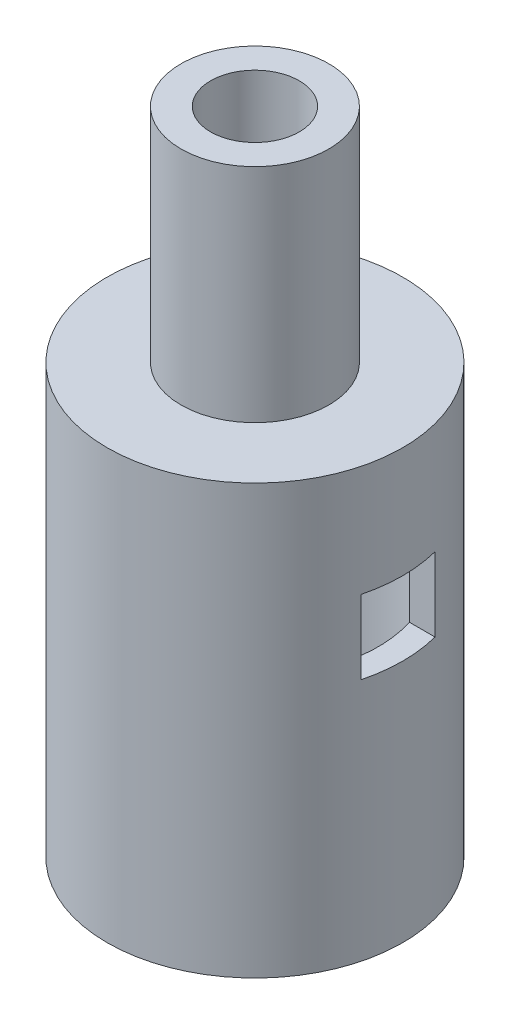
ISO-10303-21;
HEADER;
FILE_DESCRIPTION(('STEP AP214'),'2;1');
FILE_NAME('part.step','',(''),(''),'','','');
FILE_SCHEMA(('AUTOMOTIVE_DESIGN { 1 0 10303 214 1 1 1 1 }'));
ENDSEC;
DATA;
#1=APPLICATION_CONTEXT('core data for automotive mechanical design processes');
#2=APPLICATION_PROTOCOL_DEFINITION('international standard','automotive_design',2000,#1);
#3=PRODUCT_CONTEXT('',#1,'mechanical');
#4=PRODUCT('Part','Part','',(#3));
#5=PRODUCT_RELATED_PRODUCT_CATEGORY('part','',(#4));
#6=PRODUCT_DEFINITION_FORMATION('','',#4);
#7=PRODUCT_DEFINITION_CONTEXT('part definition',#1,'design');
#8=PRODUCT_DEFINITION('design','',#6,#7);
#9=PRODUCT_DEFINITION_SHAPE('','',#8);
#10=(LENGTH_UNIT() NAMED_UNIT(*) SI_UNIT(.MILLI.,.METRE.));
#11=(NAMED_UNIT(*) PLANE_ANGLE_UNIT() SI_UNIT($,.RADIAN.));
#12=(NAMED_UNIT(*) SI_UNIT($,.STERADIAN.) SOLID_ANGLE_UNIT());
#13=UNCERTAINTY_MEASURE_WITH_UNIT(LENGTH_MEASURE(1.E-05),#10,'distance_accuracy_value','');
#14=(GEOMETRIC_REPRESENTATION_CONTEXT(3) GLOBAL_UNCERTAINTY_ASSIGNED_CONTEXT((#13)) GLOBAL_UNIT_ASSIGNED_CONTEXT((#10,
#11,#12)) REPRESENTATION_CONTEXT('',''));
#15=CARTESIAN_POINT('',(0.,0.,0.));
#16=DIRECTION('',(0.,0.,1.));
#17=DIRECTION('',(1.,0.,0.));
#18=AXIS2_PLACEMENT_3D('',#15,#16,#17);
#19=CARTESIAN_POINT('',(0.,-22.098,0.));
#20=DIRECTION('',(0.,1.,0.));
#21=DIRECTION('',(0.,0.,1.));
#22=AXIS2_PLACEMENT_3D('',#19,#20,#21);
#23=CYLINDRICAL_SURFACE('',#22,7.62);
#24=CARTESIAN_POINT('',(0.,-5.715,0.));
#25=DIRECTION('',(0.,1.,0.));
#26=DIRECTION('',(0.,0.,1.));
#27=AXIS2_PLACEMENT_3D('',#24,#25,#26);
#28=CIRCLE('',#27,7.62);
#29=CARTESIAN_POINT('',(-7.37803327452513,-5.715,1.905));
#30=VERTEX_POINT('',#29);
#31=CARTESIAN_POINT('',(-7.37803327452513,-5.715,-1.905));
#32=VERTEX_POINT('',#31);
#33=EDGE_CURVE('E124',#30,#32,#28,.F.);
#34=ORIENTED_EDGE('',*,*,#33,.F.);
#35=DIRECTION('',(0.,1.,0.));
#36=VECTOR('',#35,1.);
#37=CARTESIAN_POINT('',(-7.37803327452513,-22.098,1.90499999999999));
#38=LINE('',#37,#36);
#39=CARTESIAN_POINT('',(-7.37803327452513,-9.525,1.905));
#40=VERTEX_POINT('',#39);
#41=EDGE_CURVE('E111',#40,#30,#38,.T.);
#42=ORIENTED_EDGE('',*,*,#41,.F.);
#43=CARTESIAN_POINT('',(0.,-9.525,0.));
#44=DIRECTION('',(0.,-1.,0.));
#45=DIRECTION('',(0.,0.,-1.));
#46=AXIS2_PLACEMENT_3D('',#43,#44,#45);
#47=CIRCLE('',#46,7.62);
#48=CARTESIAN_POINT('',(-7.37803327452513,-9.525,-1.905));
#49=VERTEX_POINT('',#48);
#50=EDGE_CURVE('E143',#49,#40,#47,.F.);
#51=ORIENTED_EDGE('',*,*,#50,.F.);
#52=DIRECTION('',(0.,1.,0.));
#53=VECTOR('',#52,1.);
#54=CARTESIAN_POINT('',(-7.37803327452513,-22.098,-1.905));
#55=LINE('',#54,#53);
#56=EDGE_CURVE('E132',#32,#49,#55,.F.);
#57=ORIENTED_EDGE('',*,*,#56,.F.);
#58=EDGE_LOOP('',(#34,#42,#51,#57));
#59=FACE_BOUND('',#58,.T.);
#60=CARTESIAN_POINT('',(7.37803327452513,-5.715,-1.905));
#61=VERTEX_POINT('',#60);
#62=CARTESIAN_POINT('',(7.37803327452513,-5.715,1.905));
#63=VERTEX_POINT('',#62);
#64=EDGE_CURVE('E131',#61,#63,#28,.F.);
#65=ORIENTED_EDGE('',*,*,#64,.F.);
#66=DIRECTION('',(0.,1.,0.));
#67=VECTOR('',#66,1.);
#68=CARTESIAN_POINT('',(7.37803327452513,-22.098,-1.905));
#69=LINE('',#68,#67);
#70=CARTESIAN_POINT('',(7.37803327452513,-9.525,-1.905));
#71=VERTEX_POINT('',#70);
#72=EDGE_CURVE('E149',#71,#61,#69,.T.);
#73=ORIENTED_EDGE('',*,*,#72,.F.);
#74=CARTESIAN_POINT('',(7.37803327452513,-9.525,1.905));
#75=VERTEX_POINT('',#74);
#76=EDGE_CURVE('E144',#75,#71,#47,.F.);
#77=ORIENTED_EDGE('',*,*,#76,.F.);
#78=DIRECTION('',(0.,1.,0.));
#79=VECTOR('',#78,1.);
#80=CARTESIAN_POINT('',(7.37803327452513,-22.098,1.90499999999999));
#81=LINE('',#80,#79);
#82=EDGE_CURVE('E125',#63,#75,#81,.F.);
#83=ORIENTED_EDGE('',*,*,#82,.F.);
#84=EDGE_LOOP('',(#65,#73,#77,#83));
#85=FACE_BOUND('',#84,.T.);
#86=CARTESIAN_POINT('',(0.,-22.098,0.));
#87=DIRECTION('',(0.,1.,0.));
#88=DIRECTION('',(0.,0.,1.));
#89=AXIS2_PLACEMENT_3D('',#86,#87,#88);
#90=CIRCLE('',#89,7.62);
#91=CARTESIAN_POINT('',(0.,-22.098,7.62));
#92=VERTEX_POINT('',#91);
#93=EDGE_CURVE('E177',#92,#92,#90,.T.);
#94=ORIENTED_EDGE('',*,*,#93,.T.);
#95=EDGE_LOOP('',(#94));
#96=FACE_BOUND('',#95,.T.);
#97=CARTESIAN_POINT('',(0.,0.,0.));
#98=DIRECTION('',(0.,1.,0.));
#99=DIRECTION('',(0.,0.,1.));
#100=AXIS2_PLACEMENT_3D('',#97,#98,#99);
#101=CIRCLE('',#100,7.62);
#102=CARTESIAN_POINT('',(0.,0.,7.62));
#103=VERTEX_POINT('',#102);
#104=EDGE_CURVE('E189',#103,#103,#101,.T.);
#105=ORIENTED_EDGE('',*,*,#104,.F.);
#106=EDGE_LOOP('',(#105));
#107=FACE_BOUND('',#106,.T.);
#108=ADVANCED_FACE('F44',(#59,#85,#96,#107),#23,.T.);
#109=CARTESIAN_POINT('',(0.,-22.098,0.));
#110=DIRECTION('',(0.,1.,0.));
#111=DIRECTION('',(0.,0.,1.));
#112=AXIS2_PLACEMENT_3D('',#109,#110,#111);
#113=PLANE('',#112);
#114=CARTESIAN_POINT('',(0.,-22.098,0.));
#115=DIRECTION('',(0.,-1.,0.));
#116=DIRECTION('',(0.,0.,-1.));
#117=AXIS2_PLACEMENT_3D('',#114,#115,#116);
#118=CIRCLE('',#117,6.35);
#119=CARTESIAN_POINT('',(0.,-22.098,-6.35));
#120=VERTEX_POINT('',#119);
#121=EDGE_CURVE('E186',#120,#120,#118,.T.);
#122=ORIENTED_EDGE('',*,*,#121,.F.);
#123=EDGE_LOOP('',(#122));
#124=FACE_BOUND('',#123,.T.);
#125=ORIENTED_EDGE('',*,*,#93,.F.);
#126=EDGE_LOOP('',(#125));
#127=FACE_BOUND('',#126,.T.);
#128=ADVANCED_FACE('F267',(#124,#127),#113,.F.);
#129=CARTESIAN_POINT('',(0.,0.,0.));
#130=DIRECTION('',(0.,1.,0.));
#131=DIRECTION('',(0.,0.,1.));
#132=AXIS2_PLACEMENT_3D('',#129,#130,#131);
#133=PLANE('',#132);
#134=CARTESIAN_POINT('',(0.,0.,0.));
#135=DIRECTION('',(0.,1.,0.));
#136=DIRECTION('',(0.,0.,1.));
#137=AXIS2_PLACEMENT_3D('',#134,#135,#136);
#138=CIRCLE('',#137,3.81);
#139=CARTESIAN_POINT('',(0.,0.,3.81));
#140=VERTEX_POINT('',#139);
#141=EDGE_CURVE('E172',#140,#140,#138,.T.);
#142=ORIENTED_EDGE('',*,*,#141,.F.);
#143=EDGE_LOOP('',(#142));
#144=FACE_BOUND('',#143,.T.);
#145=ORIENTED_EDGE('',*,*,#104,.T.);
#146=EDGE_LOOP('',(#145));
#147=FACE_BOUND('',#146,.T.);
#148=ADVANCED_FACE('F274',(#144,#147),#133,.T.);
#149=CARTESIAN_POINT('',(0.,-5.33400000000001,0.));
#150=DIRECTION('',(0.,-1.,0.));
#151=DIRECTION('',(0.,0.,-1.));
#152=AXIS2_PLACEMENT_3D('',#149,#150,#151);
#153=CYLINDRICAL_SURFACE('',#152,6.35);
#154=CARTESIAN_POINT('',(0.,-5.715,0.));
#155=DIRECTION('',(0.,1.,0.));
#156=DIRECTION('',(0.,0.,1.));
#157=AXIS2_PLACEMENT_3D('',#154,#155,#156);
#158=CIRCLE('',#157,6.35);
#159=CARTESIAN_POINT('',(-6.0575139289976,-5.715,1.905));
#160=VERTEX_POINT('',#159);
#161=CARTESIAN_POINT('',(-6.0575139289976,-5.715,-1.905));
#162=VERTEX_POINT('',#161);
#163=EDGE_CURVE('E130',#160,#162,#158,.F.);
#164=ORIENTED_EDGE('',*,*,#163,.T.);
#165=DIRECTION('',(0.,-1.,0.));
#166=VECTOR('',#165,1.);
#167=CARTESIAN_POINT('',(-6.0575139289976,-5.33400000000001,-1.905));
#168=LINE('',#167,#166);
#169=CARTESIAN_POINT('',(-6.0575139289976,-9.525,-1.905));
#170=VERTEX_POINT('',#169);
#171=EDGE_CURVE('E11',#162,#170,#168,.T.);
#172=ORIENTED_EDGE('',*,*,#171,.T.);
#173=CARTESIAN_POINT('',(0.,-9.525,0.));
#174=DIRECTION('',(0.,-1.,0.));
#175=DIRECTION('',(0.,0.,-1.));
#176=AXIS2_PLACEMENT_3D('',#173,#174,#175);
#177=CIRCLE('',#176,6.35);
#178=CARTESIAN_POINT('',(-6.0575139289976,-9.525,1.905));
#179=VERTEX_POINT('',#178);
#180=EDGE_CURVE('E52',#170,#179,#177,.F.);
#181=ORIENTED_EDGE('',*,*,#180,.T.);
#182=DIRECTION('',(0.,-1.,0.));
#183=VECTOR('',#182,1.);
#184=CARTESIAN_POINT('',(-6.0575139289976,-5.33400000000001,1.905));
#185=LINE('',#184,#183);
#186=EDGE_CURVE('E218',#179,#160,#185,.F.);
#187=ORIENTED_EDGE('',*,*,#186,.T.);
#188=EDGE_LOOP('',(#164,#172,#181,#187));
#189=FACE_BOUND('',#188,.T.);
#190=CARTESIAN_POINT('',(6.0575139289976,-9.525,1.905));
#191=VERTEX_POINT('',#190);
#192=CARTESIAN_POINT('',(6.0575139289976,-9.525,-1.905));
#193=VERTEX_POINT('',#192);
#194=EDGE_CURVE('E209',#191,#193,#177,.F.);
#195=ORIENTED_EDGE('',*,*,#194,.T.);
#196=DIRECTION('',(0.,-1.,0.));
#197=VECTOR('',#196,1.);
#198=CARTESIAN_POINT('',(6.0575139289976,-5.33400000000001,-1.905));
#199=LINE('',#198,#197);
#200=CARTESIAN_POINT('',(6.0575139289976,-5.715,-1.905));
#201=VERTEX_POINT('',#200);
#202=EDGE_CURVE('E214',#193,#201,#199,.F.);
#203=ORIENTED_EDGE('',*,*,#202,.T.);
#204=CARTESIAN_POINT('',(6.0575139289976,-5.715,1.905));
#205=VERTEX_POINT('',#204);
#206=EDGE_CURVE('E178',#201,#205,#158,.F.);
#207=ORIENTED_EDGE('',*,*,#206,.T.);
#208=DIRECTION('',(0.,-1.,0.));
#209=VECTOR('',#208,1.);
#210=CARTESIAN_POINT('',(6.0575139289976,-5.33400000000001,1.905));
#211=LINE('',#210,#209);
#212=EDGE_CURVE('E204',#205,#191,#211,.T.);
#213=ORIENTED_EDGE('',*,*,#212,.T.);
#214=EDGE_LOOP('',(#195,#203,#207,#213));
#215=FACE_BOUND('',#214,.T.);
#216=CARTESIAN_POINT('',(0.,-5.33400000000001,0.));
#217=DIRECTION('',(0.,-1.,0.));
#218=DIRECTION('',(0.,0.,-1.));
#219=AXIS2_PLACEMENT_3D('',#216,#217,#218);
#220=CIRCLE('',#219,6.35);
#221=CARTESIAN_POINT('',(0.,-5.33400000000001,-6.35));
#222=VERTEX_POINT('',#221);
#223=EDGE_CURVE('E183',#222,#222,#220,.T.);
#224=ORIENTED_EDGE('',*,*,#223,.F.);
#225=EDGE_LOOP('',(#224));
#226=FACE_BOUND('',#225,.T.);
#227=ORIENTED_EDGE('',*,*,#121,.T.);
#228=EDGE_LOOP('',(#227));
#229=FACE_BOUND('',#228,.T.);
#230=ADVANCED_FACE('F225',(#189,#215,#226,#229),#153,.F.);
#231=CARTESIAN_POINT('',(0.,-5.33400000000001,0.));
#232=DIRECTION('',(0.,-1.,0.));
#233=DIRECTION('',(0.,0.,-1.));
#234=AXIS2_PLACEMENT_3D('',#231,#232,#233);
#235=PLANE('',#234);
#236=CARTESIAN_POINT('',(0.,-5.33400000000001,0.));
#237=DIRECTION('',(0.,-1.,0.));
#238=DIRECTION('',(0.,0.,-1.));
#239=AXIS2_PLACEMENT_3D('',#236,#237,#238);
#240=CIRCLE('',#239,2.3495);
#241=CARTESIAN_POINT('',(0.,-5.33400000000001,-2.3495));
#242=VERTEX_POINT('',#241);
#243=EDGE_CURVE('E182',#242,#242,#240,.T.);
#244=ORIENTED_EDGE('',*,*,#243,.F.);
#245=EDGE_LOOP('',(#244));
#246=FACE_BOUND('',#245,.T.);
#247=ORIENTED_EDGE('',*,*,#223,.T.);
#248=EDGE_LOOP('',(#247));
#249=FACE_BOUND('',#248,.T.);
#250=ADVANCED_FACE('F286',(#246,#249),#235,.T.);
#251=CARTESIAN_POINT('',(0.,-22.098,0.));
#252=DIRECTION('',(0.,1.,0.));
#253=DIRECTION('',(0.,0.,1.));
#254=AXIS2_PLACEMENT_3D('',#251,#252,#253);
#255=CYLINDRICAL_SURFACE('',#254,2.3495);
#256=CARTESIAN_POINT('',(0.,0.,0.));
#257=DIRECTION('',(0.,1.,0.));
#258=DIRECTION('',(0.,0.,1.));
#259=AXIS2_PLACEMENT_3D('',#256,#257,#258);
#260=CIRCLE('',#259,2.3495);
#261=CARTESIAN_POINT('',(0.,0.,2.3495));
#262=VERTEX_POINT('',#261);
#263=EDGE_CURVE('E173',#262,#262,#260,.T.);
#264=ORIENTED_EDGE('',*,*,#263,.T.);
#265=EDGE_LOOP('',(#264));
#266=FACE_BOUND('',#265,.T.);
#267=ORIENTED_EDGE('',*,*,#243,.T.);
#268=EDGE_LOOP('',(#267));
#269=FACE_BOUND('',#268,.T.);
#270=ADVANCED_FACE('F287',(#266,#269),#255,.F.);
#271=CARTESIAN_POINT('',(0.,11.43,0.));
#272=DIRECTION('',(0.,1.,0.));
#273=DIRECTION('',(0.,0.,1.));
#274=AXIS2_PLACEMENT_3D('',#271,#272,#273);
#275=PLANE('',#274);
#276=CARTESIAN_POINT('',(0.,11.43,0.));
#277=DIRECTION('',(0.,1.,0.));
#278=DIRECTION('',(0.,0.,1.));
#279=AXIS2_PLACEMENT_3D('',#276,#277,#278);
#280=CIRCLE('',#279,2.286);
#281=CARTESIAN_POINT('',(0.,11.43,2.286));
#282=VERTEX_POINT('',#281);
#283=EDGE_CURVE('E157',#282,#282,#280,.T.);
#284=ORIENTED_EDGE('',*,*,#283,.F.);
#285=EDGE_LOOP('',(#284));
#286=FACE_BOUND('',#285,.T.);
#287=CARTESIAN_POINT('',(0.,11.43,0.));
#288=DIRECTION('',(0.,1.,0.));
#289=DIRECTION('',(0.,0.,1.));
#290=AXIS2_PLACEMENT_3D('',#287,#288,#289);
#291=CIRCLE('',#290,3.81);
#292=CARTESIAN_POINT('',(0.,11.43,3.81));
#293=VERTEX_POINT('',#292);
#294=EDGE_CURVE('E168',#293,#293,#291,.T.);
#295=ORIENTED_EDGE('',*,*,#294,.T.);
#296=EDGE_LOOP('',(#295));
#297=FACE_BOUND('',#296,.T.);
#298=ADVANCED_FACE('F292',(#286,#297),#275,.T.);
#299=CARTESIAN_POINT('',(0.,11.43,0.));
#300=DIRECTION('',(0.,-1.,0.));
#301=DIRECTION('',(0.,0.,-1.));
#302=AXIS2_PLACEMENT_3D('',#299,#300,#301);
#303=CYLINDRICAL_SURFACE('',#302,3.81);
#304=ORIENTED_EDGE('',*,*,#294,.F.);
#305=EDGE_LOOP('',(#304));
#306=FACE_BOUND('',#305,.T.);
#307=ORIENTED_EDGE('',*,*,#141,.T.);
#308=EDGE_LOOP('',(#307));
#309=FACE_BOUND('',#308,.T.);
#310=ADVANCED_FACE('F295',(#306,#309),#303,.T.);
#311=CARTESIAN_POINT('',(0.,0.,0.));
#312=DIRECTION('',(0.,1.,0.));
#313=DIRECTION('',(0.,0.,1.));
#314=AXIS2_PLACEMENT_3D('',#311,#312,#313);
#315=PLANE('',#314);
#316=CARTESIAN_POINT('',(0.,0.,0.));
#317=DIRECTION('',(0.,-1.,0.));
#318=DIRECTION('',(0.,0.,-1.));
#319=AXIS2_PLACEMENT_3D('',#316,#317,#318);
#320=CIRCLE('',#319,1.7198336091763);
#321=CARTESIAN_POINT('',(0.,0.,-1.7198336091763));
#322=VERTEX_POINT('',#321);
#323=EDGE_CURVE('E155',#322,#322,#320,.T.);
#324=ORIENTED_EDGE('',*,*,#323,.F.);
#325=EDGE_LOOP('',(#324));
#326=FACE_BOUND('',#325,.T.);
#327=ORIENTED_EDGE('',*,*,#263,.F.);
#328=EDGE_LOOP('',(#327));
#329=FACE_BOUND('',#328,.T.);
#330=ADVANCED_FACE('F300',(#326,#329),#315,.F.);
#331=CARTESIAN_POINT('',(0.,0.253999999999994,0.));
#332=DIRECTION('',(0.,1.,0.));
#333=DIRECTION('',(0.,0.,1.));
#334=AXIS2_PLACEMENT_3D('',#331,#332,#333);
#335=CYLINDRICAL_SURFACE('',#334,2.286);
#336=CARTESIAN_POINT('',(0.,0.253999999999994,0.));
#337=DIRECTION('',(0.,1.,0.));
#338=DIRECTION('',(0.,0.,1.));
#339=AXIS2_PLACEMENT_3D('',#336,#337,#338);
#340=CIRCLE('',#339,2.286);
#341=CARTESIAN_POINT('',(0.,0.253999999999994,2.286));
#342=VERTEX_POINT('',#341);
#343=EDGE_CURVE('E162',#342,#342,#340,.T.);
#344=ORIENTED_EDGE('',*,*,#343,.F.);
#345=EDGE_LOOP('',(#344));
#346=FACE_BOUND('',#345,.T.);
#347=ORIENTED_EDGE('',*,*,#283,.T.);
#348=EDGE_LOOP('',(#347));
#349=FACE_BOUND('',#348,.T.);
#350=ADVANCED_FACE('F301',(#346,#349),#335,.F.);
#351=CARTESIAN_POINT('',(0.,0.253999999999994,0.));
#352=DIRECTION('',(0.,1.,0.));
#353=DIRECTION('',(0.,0.,1.));
#354=AXIS2_PLACEMENT_3D('',#351,#352,#353);
#355=PLANE('',#354);
#356=CARTESIAN_POINT('',(0.,0.253999999999994,0.));
#357=DIRECTION('',(0.,1.,0.));
#358=DIRECTION('',(0.,0.,1.));
#359=AXIS2_PLACEMENT_3D('',#356,#357,#358);
#360=CIRCLE('',#359,1.7198336091763);
#361=CARTESIAN_POINT('',(0.,0.253999999999994,-1.7198336091763));
#362=VERTEX_POINT('',#361);
#363=EDGE_CURVE('E152',#362,#362,#360,.F.);
#364=ORIENTED_EDGE('',*,*,#363,.T.);
#365=EDGE_LOOP('',(#364));
#366=FACE_BOUND('',#365,.T.);
#367=ORIENTED_EDGE('',*,*,#343,.T.);
#368=EDGE_LOOP('',(#367));
#369=FACE_BOUND('',#368,.T.);
#370=ADVANCED_FACE('F308',(#366,#369),#355,.T.);
#371=CARTESIAN_POINT('',(0.,11.431,0.));
#372=DIRECTION('',(0.,-1.,0.));
#373=DIRECTION('',(0.,0.,-1.));
#374=AXIS2_PLACEMENT_3D('',#371,#372,#373);
#375=CYLINDRICAL_SURFACE('',#374,1.7198336091763);
#376=CARTESIAN_POINT('',(0.,0.253999999999994,-1.7198336091763));
#377=CARTESIAN_POINT('',(0.,0.251354166666661,-1.7198336091763));
#378=CARTESIAN_POINT('',(0.,0.248708333333328,-1.7198336091763));
#379=CARTESIAN_POINT('',(0.,0.243416666666661,-1.7198336091763));
#380=CARTESIAN_POINT('',(0.,0.240770833333327,-1.7198336091763));
#381=CARTESIAN_POINT('',(0.,0.23547916666666,-1.7198336091763));
#382=CARTESIAN_POINT('',(0.,0.232833333333327,-1.7198336091763));
#383=CARTESIAN_POINT('',(0.,0.227541666666661,-1.7198336091763));
#384=CARTESIAN_POINT('',(0.,0.224895833333328,-1.7198336091763));
#385=CARTESIAN_POINT('',(0.,0.219604166666661,-1.7198336091763));
#386=CARTESIAN_POINT('',(0.,0.216958333333328,-1.7198336091763));
#387=CARTESIAN_POINT('',(0.,0.211666666666661,-1.7198336091763));
#388=CARTESIAN_POINT('',(0.,0.209020833333328,-1.7198336091763));
#389=CARTESIAN_POINT('',(0.,0.203729166666662,-1.7198336091763));
#390=CARTESIAN_POINT('',(0.,0.201083333333329,-1.7198336091763));
#391=CARTESIAN_POINT('',(0.,0.195791666666662,-1.7198336091763));
#392=CARTESIAN_POINT('',(0.,0.193145833333329,-1.7198336091763));
#393=CARTESIAN_POINT('',(0.,0.187854166666663,-1.7198336091763));
#394=CARTESIAN_POINT('',(0.,0.185208333333329,-1.7198336091763));
#395=CARTESIAN_POINT('',(0.,0.179916666666662,-1.7198336091763));
#396=CARTESIAN_POINT('',(0.,0.177270833333329,-1.7198336091763));
#397=CARTESIAN_POINT('',(0.,0.171979166666663,-1.7198336091763));
#398=CARTESIAN_POINT('',(0.,0.16933333333333,-1.7198336091763));
#399=CARTESIAN_POINT('',(0.,0.164041666666663,-1.7198336091763));
#400=CARTESIAN_POINT('',(0.,0.161395833333329,-1.7198336091763));
#401=CARTESIAN_POINT('',(0.,0.156104166666663,-1.7198336091763));
#402=CARTESIAN_POINT('',(0.,0.15345833333333,-1.7198336091763));
#403=CARTESIAN_POINT('',(0.,0.148166666666663,-1.7198336091763));
#404=CARTESIAN_POINT('',(0.,0.14552083333333,-1.7198336091763));
#405=CARTESIAN_POINT('',(0.,0.140229166666664,-1.7198336091763));
#406=CARTESIAN_POINT('',(0.,0.13758333333333,-1.7198336091763));
#407=CARTESIAN_POINT('',(0.,0.132291666666663,-1.7198336091763));
#408=CARTESIAN_POINT('',(0.,0.12964583333333,-1.7198336091763));
#409=CARTESIAN_POINT('',(0.,0.124354166666664,-1.7198336091763));
#410=CARTESIAN_POINT('',(0.,0.121708333333331,-1.7198336091763));
#411=CARTESIAN_POINT('',(0.,0.116416666666664,-1.7198336091763));
#412=CARTESIAN_POINT('',(0.,0.11377083333333,-1.7198336091763));
#413=CARTESIAN_POINT('',(0.,0.108479166666664,-1.7198336091763));
#414=CARTESIAN_POINT('',(0.,0.10583333333333,-1.7198336091763));
#415=CARTESIAN_POINT('',(0.,0.100541666666664,-1.7198336091763));
#416=CARTESIAN_POINT('',(0.,0.0978958333333312,-1.7198336091763));
#417=CARTESIAN_POINT('',(0.,0.0926041666666644,-1.7198336091763));
#418=CARTESIAN_POINT('',(0.,0.0899583333333308,-1.7198336091763));
#419=CARTESIAN_POINT('',(0.,0.084666666666664,-1.7198336091763));
#420=CARTESIAN_POINT('',(0.,0.0820208333333309,-1.7198336091763));
#421=CARTESIAN_POINT('',(0.,0.0767291666666648,-1.7198336091763));
#422=CARTESIAN_POINT('',(0.,0.0740833333333317,-1.7198336091763));
#423=CARTESIAN_POINT('',(0.,0.0687916666666649,-1.7198336091763));
#424=CARTESIAN_POINT('',(0.,0.0661458333333313,-1.7198336091763));
#425=CARTESIAN_POINT('',(0.,0.0608541666666645,-1.7198336091763));
#426=CARTESIAN_POINT('',(0.,0.0582083333333314,-1.7198336091763));
#427=CARTESIAN_POINT('',(0.,0.0529166666666652,-1.7198336091763));
#428=CARTESIAN_POINT('',(0.,0.0502708333333321,-1.7198336091763));
#429=CARTESIAN_POINT('',(0.,0.044979166666666,-1.7198336091763));
#430=CARTESIAN_POINT('',(0.,0.0423333333333329,-1.7198336091763));
#431=CARTESIAN_POINT('',(0.,0.0370416666666661,-1.7198336091763));
#432=CARTESIAN_POINT('',(0.,0.0343958333333325,-1.7198336091763));
#433=CARTESIAN_POINT('',(0.,0.0291041666666657,-1.7198336091763));
#434=CARTESIAN_POINT('',(0.,0.0264583333333326,-1.7198336091763));
#435=CARTESIAN_POINT('',(0.,0.0211666666666664,-1.7198336091763));
#436=CARTESIAN_POINT('',(0.,0.0185208333333334,-1.7198336091763));
#437=CARTESIAN_POINT('',(0.,0.0132291666666666,-1.7198336091763));
#438=CARTESIAN_POINT('',(0.,0.0105833333333329,-1.7198336091763));
#439=CARTESIAN_POINT('',(0.,0.00529166666666618,-1.7198336091763));
#440=CARTESIAN_POINT('',(0.,0.00264583333333309,-1.7198336091763));
#441=CARTESIAN_POINT('',(0.,0.,-1.7198336091763));
#442=B_SPLINE_CURVE_WITH_KNOTS('',3,(#376,#377,#378,#379,#380,#381,#382,#383,#384,#385,#386,
#387,#388,#389,#390,#391,#392,#393,#394,#395,#396,#397,#398,#399,#400,#401,#402,#403,#404,#405,
#406,#407,#408,#409,#410,#411,#412,#413,#414,#415,#416,#417,#418,#419,#420,#421,#422,#423,#424,
#425,#426,#427,#428,#429,#430,#431,#432,#433,#434,#435,#436,#437,#438,#439,#440,#441),
.UNSPECIFIED.,.F.,.F.,(4,2,2,2,2,2,2,2,2,2,2,2,2,2,2,2,2,2,2,2,2,2,2,2,2,2,2,2,2,2,2,2,4),(0.,
0.00793749999999926,0.0158750000000003,0.0238124999999995,0.0317499999999988,0.0396874999999998,
0.0476249999999991,0.0555624999999983,0.0634999999999976,0.0714374999999986,0.0793749999999979,
0.0873124999999971,0.0952499999999981,0.103187499999997,0.111124999999997,0.119062499999998,
0.126999999999997,0.134937499999996,0.142874999999997,0.150812499999996,0.158749999999996,
0.166687499999997,0.174624999999996,0.182562499999995,0.190499999999996,0.198437499999995,
0.206374999999995,0.214312499999994,0.222249999999995,0.230187499999994,0.238124999999994,
0.246062499999995,0.253999999999994),.UNSPECIFIED.);
#443=EDGE_CURVE('BSEAM311',#362,#322,#442,.T.);
#444=ORIENTED_EDGE('',*,*,#363,.F.);
#445=ORIENTED_EDGE('',*,*,#323,.T.);
#446=ORIENTED_EDGE('',*,*,#443,.T.);
#447=ORIENTED_EDGE('',*,*,#443,.F.);
#448=EDGE_LOOP('',(#444,#446,#445,#447));
#449=FACE_BOUND('',#448,.T.);
#450=ADVANCED_FACE('F311',(#449),#375,.F.);
#451=CARTESIAN_POINT('',(-7.62,-5.715,1.905));
#452=DIRECTION('',(0.,1.,0.));
#453=DIRECTION('',(0.,0.,1.));
#454=AXIS2_PLACEMENT_3D('',#451,#452,#453);
#455=PLANE('',#454);
#456=ORIENTED_EDGE('',*,*,#64,.T.);
#457=DIRECTION('',(1.,0.,0.));
#458=VECTOR('',#457,1.);
#459=CARTESIAN_POINT('',(-7.62,-5.715,1.905));
#460=LINE('',#459,#458);
#461=EDGE_CURVE('E67',#205,#63,#460,.T.);
#462=ORIENTED_EDGE('',*,*,#461,.F.);
#463=ORIENTED_EDGE('',*,*,#206,.F.);
#464=DIRECTION('',(1.,0.,0.));
#465=VECTOR('',#464,1.);
#466=CARTESIAN_POINT('',(-7.62,-5.715,-1.905));
#467=LINE('',#466,#465);
#468=EDGE_CURVE('E139',#201,#61,#467,.T.);
#469=ORIENTED_EDGE('',*,*,#468,.T.);
#470=EDGE_LOOP('',(#456,#462,#463,#469));
#471=FACE_BOUND('',#470,.T.);
#472=ADVANCED_FACE('F244',(#471),#455,.F.);
#473=CARTESIAN_POINT('',(-7.62,-5.715,1.905));
#474=DIRECTION('',(0.,0.,1.));
#475=DIRECTION('',(0.,-1.,0.));
#476=AXIS2_PLACEMENT_3D('',#473,#474,#475);
#477=PLANE('',#476);
#478=ORIENTED_EDGE('',*,*,#82,.T.);
#479=DIRECTION('',(1.,0.,0.));
#480=VECTOR('',#479,1.);
#481=CARTESIAN_POINT('',(-7.62,-9.525,1.905));
#482=LINE('',#481,#480);
#483=EDGE_CURVE('E126',#191,#75,#482,.T.);
#484=ORIENTED_EDGE('',*,*,#483,.F.);
#485=ORIENTED_EDGE('',*,*,#212,.F.);
#486=ORIENTED_EDGE('',*,*,#461,.T.);
#487=EDGE_LOOP('',(#478,#484,#485,#486));
#488=FACE_BOUND('',#487,.T.);
#489=ADVANCED_FACE('F252',(#488),#477,.F.);
#490=CARTESIAN_POINT('',(-7.62,-9.525,1.905));
#491=DIRECTION('',(0.,-1.,0.));
#492=DIRECTION('',(0.,0.,-1.));
#493=AXIS2_PLACEMENT_3D('',#490,#491,#492);
#494=PLANE('',#493);
#495=ORIENTED_EDGE('',*,*,#76,.T.);
#496=DIRECTION('',(1.,0.,0.));
#497=VECTOR('',#496,1.);
#498=CARTESIAN_POINT('',(-7.62,-9.525,-1.905));
#499=LINE('',#498,#497);
#500=EDGE_CURVE('E229',#193,#71,#499,.T.);
#501=ORIENTED_EDGE('',*,*,#500,.F.);
#502=ORIENTED_EDGE('',*,*,#194,.F.);
#503=ORIENTED_EDGE('',*,*,#483,.T.);
#504=EDGE_LOOP('',(#495,#501,#502,#503));
#505=FACE_BOUND('',#504,.T.);
#506=ADVANCED_FACE('F254',(#505),#494,.F.);
#507=CARTESIAN_POINT('',(-7.62,-5.715,-1.905));
#508=DIRECTION('',(0.,0.,-1.));
#509=DIRECTION('',(0.,1.,0.));
#510=AXIS2_PLACEMENT_3D('',#507,#508,#509);
#511=PLANE('',#510);
#512=ORIENTED_EDGE('',*,*,#72,.T.);
#513=ORIENTED_EDGE('',*,*,#468,.F.);
#514=ORIENTED_EDGE('',*,*,#202,.F.);
#515=ORIENTED_EDGE('',*,*,#500,.T.);
#516=EDGE_LOOP('',(#512,#513,#514,#515));
#517=FACE_BOUND('',#516,.T.);
#518=ADVANCED_FACE('F257',(#517),#511,.F.);
#519=ORIENTED_EDGE('',*,*,#56,.T.);
#520=EDGE_CURVE('E137',#49,#170,#499,.T.);
#521=ORIENTED_EDGE('',*,*,#520,.T.);
#522=ORIENTED_EDGE('',*,*,#171,.F.);
#523=EDGE_CURVE('E58',#32,#162,#467,.T.);
#524=ORIENTED_EDGE('',*,*,#523,.F.);
#525=EDGE_LOOP('',(#519,#521,#522,#524));
#526=FACE_BOUND('',#525,.T.);
#527=ADVANCED_FACE('F228',(#526),#511,.F.);
#528=ORIENTED_EDGE('',*,*,#50,.T.);
#529=EDGE_CURVE('E120',#40,#179,#482,.T.);
#530=ORIENTED_EDGE('',*,*,#529,.T.);
#531=ORIENTED_EDGE('',*,*,#180,.F.);
#532=ORIENTED_EDGE('',*,*,#520,.F.);
#533=EDGE_LOOP('',(#528,#530,#531,#532));
#534=FACE_BOUND('',#533,.T.);
#535=ADVANCED_FACE('F262',(#534),#494,.F.);
#536=ORIENTED_EDGE('',*,*,#41,.T.);
#537=EDGE_CURVE('E112',#30,#160,#460,.T.);
#538=ORIENTED_EDGE('',*,*,#537,.T.);
#539=ORIENTED_EDGE('',*,*,#186,.F.);
#540=ORIENTED_EDGE('',*,*,#529,.F.);
#541=EDGE_LOOP('',(#536,#538,#539,#540));
#542=FACE_BOUND('',#541,.T.);
#543=ADVANCED_FACE('F113',(#542),#477,.F.);
#544=ORIENTED_EDGE('',*,*,#33,.T.);
#545=ORIENTED_EDGE('',*,*,#523,.T.);
#546=ORIENTED_EDGE('',*,*,#163,.F.);
#547=ORIENTED_EDGE('',*,*,#537,.F.);
#548=EDGE_LOOP('',(#544,#545,#546,#547));
#549=FACE_BOUND('',#548,.T.);
#550=ADVANCED_FACE('F123',(#549),#455,.F.);
#551=CLOSED_SHELL('',(#108,#128,#148,#230,#250,#270,#298,#310,#330,#350,#370,#450,#472,#489,
#506,#518,#527,#535,#543,#550));
#552=MANIFOLD_SOLID_BREP('B2',#551);
#553=ADVANCED_BREP_SHAPE_REPRESENTATION('',(#18,#552),#14);
#554=SHAPE_DEFINITION_REPRESENTATION(#9,#553);
ENDSEC;
END-ISO-10303-21;
